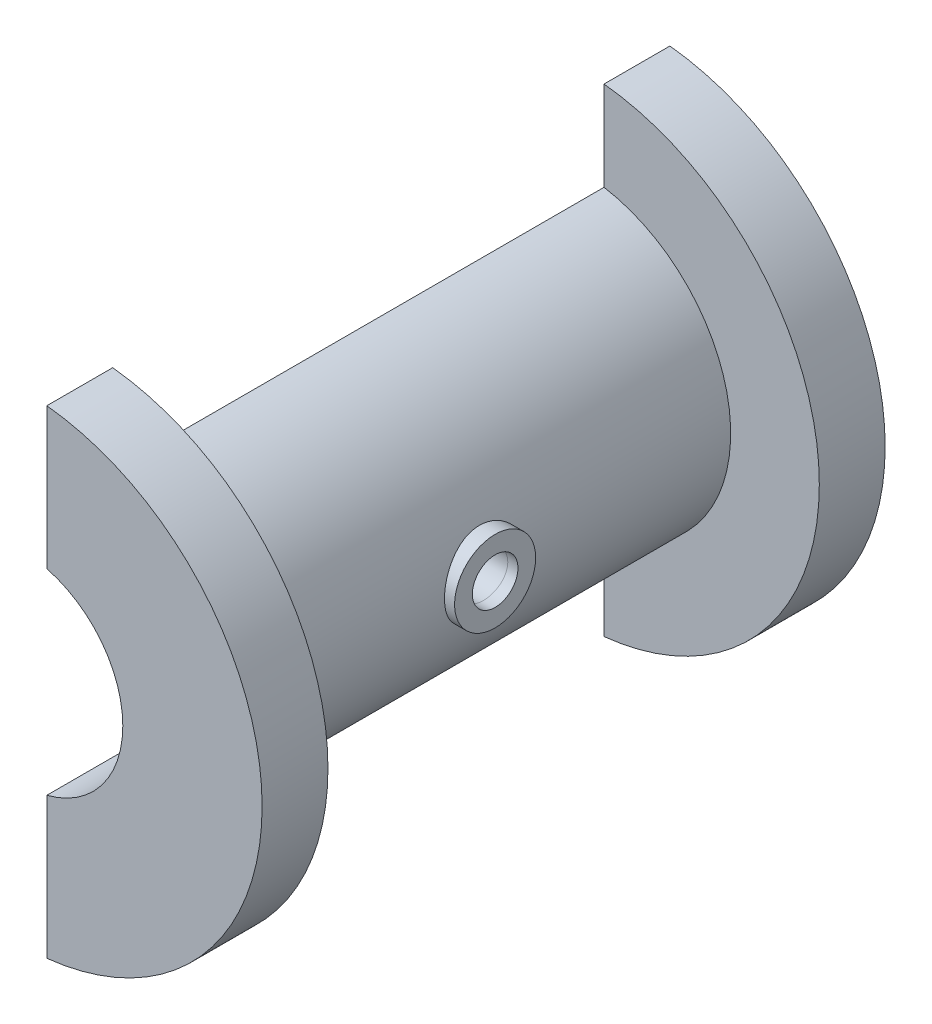
ISO-10303-21;
HEADER;
FILE_DESCRIPTION(('STEP AP214'),'2;1');
FILE_NAME('part.step','',(''),(''),'','','');
FILE_SCHEMA(('AUTOMOTIVE_DESIGN { 1 0 10303 214 1 1 1 1 }'));
ENDSEC;
DATA;
#1=APPLICATION_CONTEXT('core data for automotive mechanical design processes');
#2=APPLICATION_PROTOCOL_DEFINITION('international standard','automotive_design',2000,#1);
#3=PRODUCT_CONTEXT('',#1,'mechanical');
#4=PRODUCT('Part','Part','',(#3));
#5=PRODUCT_RELATED_PRODUCT_CATEGORY('part','',(#4));
#6=PRODUCT_DEFINITION_FORMATION('','',#4);
#7=PRODUCT_DEFINITION_CONTEXT('part definition',#1,'design');
#8=PRODUCT_DEFINITION('design','',#6,#7);
#9=PRODUCT_DEFINITION_SHAPE('','',#8);
#10=(LENGTH_UNIT() NAMED_UNIT(*) SI_UNIT(.MILLI.,.METRE.));
#11=(NAMED_UNIT(*) PLANE_ANGLE_UNIT() SI_UNIT($,.RADIAN.));
#12=(NAMED_UNIT(*) SI_UNIT($,.STERADIAN.) SOLID_ANGLE_UNIT());
#13=UNCERTAINTY_MEASURE_WITH_UNIT(LENGTH_MEASURE(1.E-05),#10,'distance_accuracy_value','');
#14=(GEOMETRIC_REPRESENTATION_CONTEXT(3) GLOBAL_UNCERTAINTY_ASSIGNED_CONTEXT((#13)) GLOBAL_UNIT_ASSIGNED_CONTEXT((#10,
#11,#12)) REPRESENTATION_CONTEXT('',''));
#15=CARTESIAN_POINT('',(0.,0.,0.));
#16=DIRECTION('',(0.,0.,1.));
#17=DIRECTION('',(1.,0.,0.));
#18=AXIS2_PLACEMENT_3D('',#15,#16,#17);
#19=CARTESIAN_POINT('',(0.,0.,55.));
#20=DIRECTION('',(0.,0.,-1.));
#21=DIRECTION('',(-1.,0.,0.));
#22=AXIS2_PLACEMENT_3D('',#19,#20,#21);
#23=CYLINDRICAL_SURFACE('',#22,30.);
#24=CARTESIAN_POINT('',(30.,0.,-4.50000000000001));
#25=CARTESIAN_POINT('',(29.9999959731389,-0.251254633444927,-4.49998963855429));
#26=CARTESIAN_POINT('',(29.9968104761112,-0.502655055246397,-4.47888599747811));
#27=CARTESIAN_POINT('',(29.9844094791956,-0.998428883984741,-4.39505040005176));
#28=CARTESIAN_POINT('',(29.9751881081542,-1.24279520692269,-4.33227791116533));
#29=CARTESIAN_POINT('',(29.9517516365858,-1.71725425866558,-4.16702248509714));
#30=CARTESIAN_POINT('',(29.9375403111276,-1.9473576234804,-4.06456956148216));
#31=CARTESIAN_POINT('',(29.9056942773517,-2.38707128590577,-3.82293486174942));
#32=CARTESIAN_POINT('',(29.8880600445832,-2.59668442417557,-3.68375818674792));
#33=CARTESIAN_POINT('',(29.8511751297436,-2.99114015868638,-3.37146820518038));
#34=CARTESIAN_POINT('',(29.8319140167099,-3.17579949667651,-3.19812463137539));
#35=CARTESIAN_POINT('',(29.7940278339972,-3.51352472006846,-2.8229169333184));
#36=CARTESIAN_POINT('',(29.7754028009551,-3.66658878818808,-2.62105116966444));
#37=CARTESIAN_POINT('',(29.7407963237618,-3.93749188499829,-2.19329806943253));
#38=CARTESIAN_POINT('',(29.7248283592509,-4.05515361111616,-1.967297259056));
#39=CARTESIAN_POINT('',(29.697486339188,-4.25077896513169,-1.49846153806372));
#40=CARTESIAN_POINT('',(29.6861120332635,-4.3287447566749,-1.25562754576833));
#41=CARTESIAN_POINT('',(29.6693476865602,-4.44219596396734,-0.761945874384857));
#42=CARTESIAN_POINT('',(29.6639134722375,-4.47799510921554,-0.511171819775932));
#43=CARTESIAN_POINT('',(29.6595104691175,-4.50706872101798,-0.00712150203816632));
#44=CARTESIAN_POINT('',(29.6605413090944,-4.50034562921389,0.246154616587482));
#45=CARTESIAN_POINT('',(29.6689115505723,-4.44482199752363,0.745803240582428));
#46=CARTESIAN_POINT('',(29.6761985628465,-4.39637087783252,0.99221557945441));
#47=CARTESIAN_POINT('',(29.696178243791,-4.25931352211203,1.47337310661459));
#48=CARTESIAN_POINT('',(29.7088710653814,-4.17070615013437,1.70811796464224));
#49=CARTESIAN_POINT('',(29.7382900663644,-3.9554881058921,2.16034011384858));
#50=CARTESIAN_POINT('',(29.7550319029958,-3.82872942849594,2.37774590727718));
#51=CARTESIAN_POINT('',(29.7906512272364,-3.54091239386865,2.78833378734581));
#52=CARTESIAN_POINT('',(29.809528854975,-3.37985178547435,2.98151428280812));
#53=CARTESIAN_POINT('',(29.8475241916863,-3.02608479234744,3.34019298221916));
#54=CARTESIAN_POINT('',(29.8666424133844,-2.83307798892601,3.50539497085903));
#55=CARTESIAN_POINT('',(29.9027894294539,-2.42192126968256,3.80110780352179));
#56=CARTESIAN_POINT('',(29.9198182146753,-2.20377124376451,3.9316184956317));
#57=CARTESIAN_POINT('',(29.9498854675618,-1.74826379464106,4.15425925949865));
#58=CARTESIAN_POINT('',(29.9629215577628,-1.51089503351034,4.2463664755209));
#59=CARTESIAN_POINT('',(29.9835147167121,-1.02381954746118,4.38932816905614));
#60=CARTESIAN_POINT('',(29.991072155864,-0.774113657857802,4.44018543544674));
#61=CARTESIAN_POINT('',(29.9998074340161,-0.272008702930939,4.49880968945009));
#62=CARTESIAN_POINT('',(30.0010455627116,-0.0196581956114106,4.50698391413798));
#63=CARTESIAN_POINT('',(29.9971668304568,0.48281003298685,4.48109098406694));
#64=CARTESIAN_POINT('',(29.992050166241,0.732927823145633,4.44702513699572));
#65=CARTESIAN_POINT('',(29.97607405846,1.22259716229423,4.33795769946738));
#66=CARTESIAN_POINT('',(29.9652424562395,1.46219388923952,4.26315451190747));
#67=CARTESIAN_POINT('',(29.9390470697511,1.925444875929,4.07494500761474));
#68=CARTESIAN_POINT('',(29.923683072647,2.14909838638531,3.96153687799912));
#69=CARTESIAN_POINT('',(29.8899804740606,2.57590493787577,3.69838132630843));
#70=CARTESIAN_POINT('',(29.8716210488024,2.77889702967471,3.54837557996169));
#71=CARTESIAN_POINT('',(29.8340358903649,3.15697101953313,3.21664256511377));
#72=CARTESIAN_POINT('',(29.814810106886,3.33205129438022,3.03491345302606));
#73=CARTESIAN_POINT('',(29.7774679291348,3.65081354871587,2.64307940047054));
#74=CARTESIAN_POINT('',(29.7593620805276,3.79422254242264,2.4327512244157));
#75=CARTESIAN_POINT('',(29.7264965731471,4.04367387811753,1.9907518784647));
#76=CARTESIAN_POINT('',(29.7117368239688,4.14971722969308,1.75908128543561));
#77=CARTESIAN_POINT('',(29.6873109902593,4.32100401971831,1.28178739913061));
#78=CARTESIAN_POINT('',(29.6776269901931,4.38639111424907,1.03621661708627));
#79=CARTESIAN_POINT('',(29.6644014689341,4.4749664850476,0.537422953694681));
#80=CARTESIAN_POINT('',(29.6608595235531,4.49815767549201,0.284200602015978));
#81=CARTESIAN_POINT('',(29.6603349783252,4.5016136000832,-0.219987189947346));
#82=CARTESIAN_POINT('',(29.6632867900051,4.48230756501939,-0.470949725270765));
#83=CARTESIAN_POINT('',(29.6752746183352,4.40223688633137,-0.966015789970552));
#84=CARTESIAN_POINT('',(29.6843106252335,4.34147230915882,-1.21011933034018));
#85=CARTESIAN_POINT('',(29.7074257833689,4.18036120555996,-1.68441924670298));
#86=CARTESIAN_POINT('',(29.7215011114823,4.08004467972943,-1.91462601130032));
#87=CARTESIAN_POINT('',(29.7531136367311,3.84272002926928,-2.35501090140721));
#88=CARTESIAN_POINT('',(29.7706509510817,3.70571066224506,-2.56518834841094));
#89=CARTESIAN_POINT('',(29.8074223009481,3.39733012977493,-2.96172917392552));
#90=CARTESIAN_POINT('',(29.826671036459,3.22564107119417,-3.14784399974121));
#91=CARTESIAN_POINT('',(29.8645736647991,2.85344652324851,-3.48877366436348));
#92=CARTESIAN_POINT('',(29.8832274183228,2.65293434505283,-3.64358121772849));
#93=CARTESIAN_POINT('',(29.9179555737156,2.22748712263117,-3.9182630298221));
#94=CARTESIAN_POINT('',(29.9340152138646,2.00242373029428,-4.03794032764425));
#95=CARTESIAN_POINT('',(29.9616008640888,1.53525561074616,-4.23761555027415));
#96=CARTESIAN_POINT('',(29.9731315669727,1.29316883129011,-4.31765457016107));
#97=CARTESIAN_POINT('',(29.9877281778452,0.874997183667988,-4.41762402813033));
#98=CARTESIAN_POINT('',(29.9923064753867,0.701493400485836,-4.44846780461644));
#99=CARTESIAN_POINT('',(29.9984437784369,0.352016914800376,-4.48965929313794));
#100=CARTESIAN_POINT('',(30.0000028214632,0.176044243003252,-4.50000725985765));
#101=CARTESIAN_POINT('',(30.,0.,-4.50000000000001));
#102=B_SPLINE_CURVE_WITH_KNOTS('',3,(#24,#25,#26,#27,#28,#29,#30,#31,#32,#33,#34,#35,#36,#37,
#38,#39,#40,#41,#42,#43,#44,#45,#46,#47,#48,#49,#50,#51,#52,#53,#54,#55,#56,#57,#58,#59,#60,#61,
#62,#63,#64,#65,#66,#67,#68,#69,#70,#71,#72,#73,#74,#75,#76,#77,#78,#79,#80,#81,#82,#83,#84,#85,
#86,#87,#88,#89,#90,#91,#92,#93,#94,#95,#96,#97,#98,#99,#100,#101),.UNSPECIFIED.,.T.,.F.,(4,2,2,
2,2,2,2,2,2,2,2,2,2,2,2,2,2,2,2,2,2,2,2,2,2,2,2,2,2,2,2,2,2,2,2,2,2,2,4),(0.,0.753120615094991,
1.50697488878745,2.26026007074972,3.0134406725928,3.77188248410531,4.53036790717741,
5.29259107186126,6.05477268676519,6.81124693817774,7.56767775296949,8.31783531587241,
9.06801410071086,9.82114150428479,10.5743183492561,11.3350287376623,12.0957424571601,
12.8569082695463,13.6180226158021,14.3718617563277,15.1256775597347,15.8758544689785,
16.6260666112882,17.3817356411073,18.1374486008589,18.8994409975402,19.661412804265,
20.4206767037151,21.1798881641153,21.931466647832,22.683043926887,23.4340522195244,
24.1850859440064,24.9433448989717,25.701780104062,26.4643897015421,27.2262069978433,
27.7538955593643,28.2815775636988),.UNSPECIFIED.);
#103=CARTESIAN_POINT('',(30.,0.,-4.50000000000001));
#104=VERTEX_POINT('',#103);
#105=EDGE_CURVE('E56',#104,#104,#102,.T.);
#106=ORIENTED_EDGE('',*,*,#105,.F.);
#107=EDGE_LOOP('',(#106));
#108=FACE_BOUND('',#107,.T.);
#109=CARTESIAN_POINT('',(30.,0.,-8.));
#110=CARTESIAN_POINT('',(30.0000047930632,0.22057865009321,-8.00000755332287));
#111=CARTESIAN_POINT('',(29.9975638847037,0.441078618604162,-7.99087627556735));
#112=CARTESIAN_POINT('',(29.9878789889454,0.880527690255312,-7.95444770219838));
#113=CARTESIAN_POINT('',(29.9806345555866,1.09947664749168,-7.92714871989159));
#114=CARTESIAN_POINT('',(29.9615348022887,1.53421519571787,-7.85460236442112));
#115=CARTESIAN_POINT('',(29.9496784086729,1.75000403887752,-7.80935081180211));
#116=CARTESIAN_POINT('',(29.9216767769691,2.17693220172064,-7.70126399759681));
#117=CARTESIAN_POINT('',(29.9055299556575,2.38806977381498,-7.63842224453932));
#118=CARTESIAN_POINT('',(29.8694188162848,2.80379881164419,-7.4957939795611));
#119=CARTESIAN_POINT('',(29.8494609914201,3.00840073050494,-7.41603626386912));
#120=CARTESIAN_POINT('',(29.8062369400106,3.41014305480076,-7.24009882296535));
#121=CARTESIAN_POINT('',(29.7829694748771,3.60728063167395,-7.14391294701548));
#122=CARTESIAN_POINT('',(29.7337577302115,3.99266560536458,-6.9358887987671));
#123=CARTESIAN_POINT('',(29.7078144626916,4.1809163242878,-6.82405643844286));
#124=CARTESIAN_POINT('',(29.6539125450337,4.54750659590856,-6.58544143947835));
#125=CARTESIAN_POINT('',(29.6259529754043,4.72584156024369,-6.45865196299242));
#126=CARTESIAN_POINT('',(29.5681624094277,5.07501132612923,-6.18821734994425));
#127=CARTESIAN_POINT('',(29.5383045499937,5.2456122549541,-6.04427591580773));
#128=CARTESIAN_POINT('',(29.4780857786048,5.57407686176036,-5.74276474016173));
#129=CARTESIAN_POINT('',(29.4477250871443,5.73194595333085,-5.58520085061507));
#130=CARTESIAN_POINT('',(29.3873016651863,6.03409106421435,-5.25732528100958));
#131=CARTESIAN_POINT('',(29.3572391022953,6.17835978656728,-5.08700684473829));
#132=CARTESIAN_POINT('',(29.2982717118578,6.45220041997692,-4.73485391967478));
#133=CARTESIAN_POINT('',(29.2693664560245,6.58177780102008,-4.55302375656895));
#134=CARTESIAN_POINT('',(29.2130229538656,6.82755230890043,-4.17565777886857));
#135=CARTESIAN_POINT('',(29.1856194941863,6.94347370726023,-3.97993702857694));
#136=CARTESIAN_POINT('',(29.1336671025411,7.15832798081868,-3.57910981329244));
#137=CARTESIAN_POINT('',(29.1091171376739,7.25726700947707,-3.37400678217522));
#138=CARTESIAN_POINT('',(29.0636080698031,7.43742733698699,-2.95576083314441));
#139=CARTESIAN_POINT('',(29.0426491291002,7.51864783507398,-2.74261755237322));
#140=CARTESIAN_POINT('',(29.0049801777024,7.6626805607475,-2.30983414343199));
#141=CARTESIAN_POINT('',(28.9882700500103,7.72549329522525,-2.09019419434291));
#142=CARTESIAN_POINT('',(28.959956929466,7.83095203764005,-1.65106697573491));
#143=CARTESIAN_POINT('',(28.9482471463236,7.87402134875791,-1.43168822324177));
#144=CARTESIAN_POINT('',(28.9297630127215,7.94166516963208,-0.989893894342027));
#145=CARTESIAN_POINT('',(28.9229885283003,7.96624018138969,-0.767478400530273));
#146=CARTESIAN_POINT('',(28.9145897070143,7.99667132852926,-0.321308138483168));
#147=CARTESIAN_POINT('',(28.9129645665069,8.00253038485544,-0.0975535846925474));
#148=CARTESIAN_POINT('',(28.9149140483281,7.99548370789002,0.349635096079179));
#149=CARTESIAN_POINT('',(28.9184885864692,7.98257827841272,0.573069228189577));
#150=CARTESIAN_POINT('',(28.9305510183289,7.93874759581896,1.01167731618271));
#151=CARTESIAN_POINT('',(28.9388980708057,7.90833871941777,1.22690699627628));
#152=CARTESIAN_POINT('',(28.9601504503289,7.8301548664798,1.65403376182829));
#153=CARTESIAN_POINT('',(28.9730573101537,7.78237405021191,1.86592970160161));
#154=CARTESIAN_POINT('',(29.0030456839358,7.66985820348008,2.28479534122952));
#155=CARTESIAN_POINT('',(29.0201259302455,7.60512832079333,2.49176651605031));
#156=CARTESIAN_POINT('',(29.0579792646434,7.45919034864218,2.89955085854656));
#157=CARTESIAN_POINT('',(29.0787537400112,7.37797606722872,3.1003616795159));
#158=CARTESIAN_POINT('',(29.1236513457429,7.19871913874445,3.49660447511281));
#159=CARTESIAN_POINT('',(29.1478085210257,7.10050264502397,3.6919539188678));
#160=CARTESIAN_POINT('',(29.1986278932288,6.88854155962722,4.07378122001695));
#161=CARTESIAN_POINT('',(29.2252909505939,6.77479162811626,4.26025599676473));
#162=CARTESIAN_POINT('',(29.2803849259846,6.5325706304109,4.62310540084657));
#163=CARTESIAN_POINT('',(29.3088158329833,6.40409965603451,4.79948009116656));
#164=CARTESIAN_POINT('',(29.366683469807,6.13327573010405,5.14105402059826));
#165=CARTESIAN_POINT('',(29.3961202218952,5.99092247115372,5.30625301210856));
#166=CARTESIAN_POINT('',(29.4561934526224,5.68834118264564,5.6296900884806));
#167=CARTESIAN_POINT('',(29.4868375912612,5.52767975596179,5.78752159797573));
#168=CARTESIAN_POINT('',(29.5475063444805,5.19361849033296,6.08908414266926));
#169=CARTESIAN_POINT('',(29.577531159608,5.02022286058342,6.2328198007854));
#170=CARTESIAN_POINT('',(29.6361528289599,4.66169990972495,6.50532651167013));
#171=CARTESIAN_POINT('',(29.6647490841118,4.47656773947657,6.63409131589889));
#172=CARTESIAN_POINT('',(29.7196959795788,4.09592807500753,6.87562058032551));
#173=CARTESIAN_POINT('',(29.7460474903499,3.90042465066466,6.98839125403335));
#174=CARTESIAN_POINT('',(29.7959007840006,3.49933186872605,7.19764429468463));
#175=CARTESIAN_POINT('',(29.8193883919427,3.29369889679403,7.29404650042563));
#176=CARTESIAN_POINT('',(29.8626905301685,2.87472517640484,7.46910168895653));
#177=CARTESIAN_POINT('',(29.8825064328149,2.66138734354211,7.54776130574181));
#178=CARTESIAN_POINT('',(29.9179062239643,2.22846399646919,7.68671780824326));
#179=CARTESIAN_POINT('',(29.9334900581488,2.00887840210926,7.74701445827288));
#180=CARTESIAN_POINT('',(29.9599711289042,1.56509795980903,7.84871229506155));
#181=CARTESIAN_POINT('',(29.9708684981238,1.34090324251667,7.89011401663734));
#182=CARTESIAN_POINT('',(29.9874143846419,0.896138562380166,7.952729388177));
#183=CARTESIAN_POINT('',(29.9932054526486,0.67565101396004,7.97449174202197));
#184=CARTESIAN_POINT('',(29.9999053106141,0.233557953828446,7.99965421489813));
#185=CARTESIAN_POINT('',(30.0008141902206,0.0119524627196583,8.00305467109423));
#186=CARTESIAN_POINT('',(29.9977244037236,-0.430720407408283,7.99146418408705));
#187=CARTESIAN_POINT('',(29.9937262042334,-0.651787835589003,7.97647498955284));
#188=CARTESIAN_POINT('',(29.9809348682821,-1.09178012606607,7.92824037297712));
#189=CARTESIAN_POINT('',(29.9721417548676,-1.31070499865534,7.89499503868279));
#190=CARTESIAN_POINT('',(29.9501982854821,-1.74104501006533,7.81127239096026));
#191=CARTESIAN_POINT('',(29.9371263701292,-1.95252453742277,7.76110483103405));
#192=CARTESIAN_POINT('',(29.9069327349073,-2.37050563135301,7.64381029906287));
#193=CARTESIAN_POINT('',(29.8898096482769,-2.57700549194881,7.57667760289402));
#194=CARTESIAN_POINT('',(29.851972531426,-2.98352164314614,7.42600675636972));
#195=CARTESIAN_POINT('',(29.8312594934855,-3.18353970726197,7.34247313846386));
#196=CARTESIAN_POINT('',(29.7867703566693,-3.57593636687409,7.1595778616985));
#197=CARTESIAN_POINT('',(29.7629931085837,-3.76831206056049,7.0602102610954));
#198=CARTESIAN_POINT('',(29.7125131434758,-4.14775826908602,6.84431590139304));
#199=CARTESIAN_POINT('',(29.6857629669212,-4.33465565508777,6.72749594747023));
#200=CARTESIAN_POINT('',(29.6304241052245,-4.69805995168527,6.47894372317594));
#201=CARTESIAN_POINT('',(29.6018347849963,-4.87456323229017,6.34720628948886));
#202=CARTESIAN_POINT('',(29.5435821401274,-5.21600943606102,6.06973146605595));
#203=CARTESIAN_POINT('',(29.5139188100511,-5.38095230070637,5.92399400544869));
#204=CARTESIAN_POINT('',(29.4543038977114,-5.69824941655326,5.61945822117415));
#205=CARTESIAN_POINT('',(29.4243523115153,-5.85060349573143,5.46065971908936));
#206=CARTESIAN_POINT('',(29.3641150587543,-6.14590109448046,5.12630946683875));
#207=CARTESIAN_POINT('',(29.3338440974522,-6.28845400395986,4.95040980495906));
#208=CARTESIAN_POINT('',(29.2747180395519,-6.55819708628246,4.58707182130096));
#209=CARTESIAN_POINT('',(29.2458624615622,-6.68539250423754,4.39963747222171));
#210=CARTESIAN_POINT('',(29.1903856403262,-6.9236084832326,4.01434447027581));
#211=CARTESIAN_POINT('',(29.163765200616,-7.03462323776119,3.81648210977698));
#212=CARTESIAN_POINT('',(29.1135738024769,-7.23954079101904,3.41181238404079));
#213=CARTESIAN_POINT('',(29.090001613314,-7.33345050222161,3.2050086741668));
#214=CARTESIAN_POINT('',(29.0467327109949,-7.50299524013639,2.78497290269581));
#215=CARTESIAN_POINT('',(29.0270155048398,-7.57872741686942,2.57178219060545));
#216=CARTESIAN_POINT('',(28.9919142970287,-7.71191627952162,2.13950376540742));
#217=CARTESIAN_POINT('',(28.9765286332904,-7.7693799764461,1.92041834964292));
#218=CARTESIAN_POINT('',(28.9505679624228,-7.86556421887175,1.47789299709294));
#219=CARTESIAN_POINT('',(28.9399928457768,-7.90428519106988,1.25445315956074));
#220=CARTESIAN_POINT('',(28.9239941302563,-7.96263042731845,0.804912946589066));
#221=CARTESIAN_POINT('',(28.9185703860099,-7.9822552302634,0.578812646410192));
#222=CARTESIAN_POINT('',(28.9131408569839,-8.00189864511034,0.133142456262339));
#223=CARTESIAN_POINT('',(28.9129630489633,-8.00253976703757,-0.0863981384429999));
#224=CARTESIAN_POINT('',(28.9175953549484,-7.98578455758701,-0.524736290840258));
#225=CARTESIAN_POINT('',(28.9224054196029,-7.96838840467467,-0.743533855862414));
#226=CARTESIAN_POINT('',(28.9368664188399,-7.91571252441199,-1.17879225448724));
#227=CARTESIAN_POINT('',(28.9465171659621,-7.88043348959388,-1.39525317824714));
#228=CARTESIAN_POINT('',(28.9703679303139,-7.7922950777922,-1.82430878777427));
#229=CARTESIAN_POINT('',(28.984567970625,-7.73943561161185,-2.03690345391974));
#230=CARTESIAN_POINT('',(29.0169661243449,-7.61706278409508,-2.45508496971404));
#231=CARTESIAN_POINT('',(29.0351316225571,-7.54768488472808,-2.66071403742376));
#232=CARTESIAN_POINT('',(29.0750112653577,-7.39257259459484,-3.0654283339916));
#233=CARTESIAN_POINT('',(29.0967266070745,-7.30683268436169,-3.2645113279915));
#234=CARTESIAN_POINT('',(29.1430927062825,-7.11965152069296,-3.65477718182274));
#235=CARTESIAN_POINT('',(29.1677432688522,-7.01821130974537,-3.84596056511511));
#236=CARTESIAN_POINT('',(29.2193091692493,-6.80033085633953,-4.2192667971175));
#237=CARTESIAN_POINT('',(29.2462246241178,-6.68388983853063,-4.40138917681408));
#238=CARTESIAN_POINT('',(29.3024167838015,-6.43314499527037,-4.76067595224268));
#239=CARTESIAN_POINT('',(29.3317396628692,-6.29841639334604,-4.93753679841954));
#240=CARTESIAN_POINT('',(29.3912111016278,-6.01479007415766,-5.27935835072935));
#241=CARTESIAN_POINT('',(29.4213596746671,-5.86589212773197,-5.44431886432163));
#242=CARTESIAN_POINT('',(29.4816665381721,-5.55485666421669,-5.76132690170297));
#243=CARTESIAN_POINT('',(29.5118248292071,-5.39271590772654,-5.91337124732529));
#244=CARTESIAN_POINT('',(29.5713266043132,-5.05626570232196,-6.20350885082049));
#245=CARTESIAN_POINT('',(29.6006701046229,-4.88195649616389,-6.34160238687275));
#246=CARTESIAN_POINT('',(29.6583696669233,-4.51837437064452,-6.60574493005633));
#247=CARTESIAN_POINT('',(29.6866906027378,-4.32885920866295,-6.73146849206309));
#248=CARTESIAN_POINT('',(29.7408465182512,-3.93962503807925,-6.9664206980443));
#249=CARTESIAN_POINT('',(29.7666824058184,-3.73990979703194,-7.07565537430734));
#250=CARTESIAN_POINT('',(29.8151368355485,-3.3316399704608,-7.27680726839905));
#251=CARTESIAN_POINT('',(29.8377565403202,-3.12308861464552,-7.36873074792176));
#252=CARTESIAN_POINT('',(29.8791381252941,-2.6986372013561,-7.53454099060095));
#253=CARTESIAN_POINT('',(29.8979005233857,-2.48273813494224,-7.60843017532587));
#254=CARTESIAN_POINT('',(29.9421638772526,-1.89769086313885,-7.78102274388028));
#255=CARTESIAN_POINT('',(29.9637077907291,-1.5231488606223,-7.86298348522678));
#256=CARTESIAN_POINT('',(29.9926209941337,-0.765658396861658,-7.9724628724238));
#257=CARTESIAN_POINT('',(29.9999916838873,-0.382710769582184,-7.99998689475156));
#258=CARTESIAN_POINT('',(30.,0.,-8.));
#259=B_SPLINE_CURVE_WITH_KNOTS('',3,(#109,#110,#111,#112,#113,#114,#115,#116,#117,#118,#119,
#120,#121,#122,#123,#124,#125,#126,#127,#128,#129,#130,#131,#132,#133,#134,#135,#136,#137,#138,
#139,#140,#141,#142,#143,#144,#145,#146,#147,#148,#149,#150,#151,#152,#153,#154,#155,#156,#157,
#158,#159,#160,#161,#162,#163,#164,#165,#166,#167,#168,#169,#170,#171,#172,#173,#174,#175,#176,
#177,#178,#179,#180,#181,#182,#183,#184,#185,#186,#187,#188,#189,#190,#191,#192,#193,#194,#195,
#196,#197,#198,#199,#200,#201,#202,#203,#204,#205,#206,#207,#208,#209,#210,#211,#212,#213,#214,
#215,#216,#217,#218,#219,#220,#221,#222,#223,#224,#225,#226,#227,#228,#229,#230,#231,#232,#233,
#234,#235,#236,#237,#238,#239,#240,#241,#242,#243,#244,#245,#246,#247,#248,#249,#250,#251,#252,
#253,#254,#255,#256,#257,#258),.UNSPECIFIED.,.T.,.F.,(4,2,2,2,2,2,2,2,2,2,2,2,2,2,2,2,2,2,2,2,2,
2,2,2,2,2,2,2,2,2,2,2,2,2,2,2,2,2,2,2,2,2,2,2,2,2,2,2,2,2,2,2,2,2,2,2,2,2,2,2,2,2,2,2,2,2,2,2,2,
2,2,2,2,2,4),(0.,0.66139823304869,1.32285787901007,1.98447160679912,2.64632981853879,
3.3070702574184,3.96805862339447,4.62879790814604,5.28984043791279,5.96466429305822,
6.63919968283205,7.31409494326413,7.98873809084503,8.67525864701595,9.36152991903384,
10.0478321997124,10.7341155800347,11.4049041084223,12.0756744285578,12.7463400584224,
13.4169948297135,14.0688103050949,14.7208450969063,15.3726820816984,16.0247643672578,
16.6839572310016,17.3433772745751,18.0027932054408,18.6622237411095,19.3433032278852,
20.0241585935002,20.7052971222626,21.3861703085458,22.0702873433142,22.7541481595407,
23.4380177526714,24.1218679878248,24.7859608021704,25.4500414222672,26.114058899934,
26.7780731860633,27.4305389784524,28.0832252107559,28.7357313242726,29.3884828715509,
30.0537853451988,30.7193188047653,31.3848556331206,32.0504015544073,32.7348662000305,
33.4190964121669,34.1035715623455,34.7877694864007,35.4682249525505,36.1484189600495,
36.8285974815202,37.5087568077749,38.1665868538479,38.824410391243,39.4822084557194,
40.1400098576775,40.7925921674686,41.4453950060204,42.0981545175428,42.7509477819646,
43.422948394753,44.0949598776946,44.7671362404436,45.4392991973377,46.1260127490717,
46.8124744616758,47.4986873928573,48.1848081315288,49.3324678454551,50.4800142043769),.UNSPECIFIED.);
#260=CARTESIAN_POINT('',(30.,0.,-8.));
#261=VERTEX_POINT('',#260);
#262=EDGE_CURVE('E65',#261,#261,#259,.T.);
#263=ORIENTED_EDGE('',*,*,#262,.F.);
#264=EDGE_LOOP('',(#263));
#265=FACE_BOUND('',#264,.T.);
#266=ADVANCED_FACE('F51',(#108,#265),#23,.F.);
#267=CARTESIAN_POINT('',(4.99800000000001,0.,0.));
#268=DIRECTION('',(1.,0.,0.));
#269=DIRECTION('',(0.,0.,-1.));
#270=AXIS2_PLACEMENT_3D('',#267,#268,#269);
#271=CYLINDRICAL_SURFACE('',#270,8.);
#272=CARTESIAN_POINT('',(32.,0.,0.));
#273=DIRECTION('',(1.,0.,0.));
#274=DIRECTION('',(0.,0.,-1.));
#275=AXIS2_PLACEMENT_3D('',#272,#273,#274);
#276=CIRCLE('',#275,8.);
#277=CARTESIAN_POINT('',(32.,0.,-8.));
#278=VERTEX_POINT('',#277);
#279=EDGE_CURVE('E11',#278,#278,#276,.T.);
#280=ORIENTED_EDGE('',*,*,#279,.F.);
#281=EDGE_LOOP('',(#280));
#282=FACE_BOUND('',#281,.T.);
#283=ORIENTED_EDGE('',*,*,#262,.T.);
#284=EDGE_LOOP('',(#283));
#285=FACE_BOUND('',#284,.T.);
#286=ADVANCED_FACE('F53',(#282,#285),#271,.T.);
#287=CARTESIAN_POINT('',(32.,0.,0.));
#288=DIRECTION('',(1.,0.,0.));
#289=DIRECTION('',(0.,0.,-1.));
#290=AXIS2_PLACEMENT_3D('',#287,#288,#289);
#291=PLANE('',#290);
#292=CARTESIAN_POINT('',(32.,0.,0.));
#293=DIRECTION('',(1.,0.,0.));
#294=DIRECTION('',(0.,0.,-1.));
#295=AXIS2_PLACEMENT_3D('',#292,#293,#294);
#296=CIRCLE('',#295,4.50000000000001);
#297=CARTESIAN_POINT('',(32.,0.,-4.50000000000001));
#298=VERTEX_POINT('',#297);
#299=EDGE_CURVE('E74',#298,#298,#296,.T.);
#300=ORIENTED_EDGE('',*,*,#299,.F.);
#301=EDGE_LOOP('',(#300));
#302=FACE_BOUND('',#301,.T.);
#303=ORIENTED_EDGE('',*,*,#279,.T.);
#304=EDGE_LOOP('',(#303));
#305=FACE_BOUND('',#304,.T.);
#306=ADVANCED_FACE('F78',(#302,#305),#291,.T.);
#307=CARTESIAN_POINT('',(32.,0.,0.));
#308=DIRECTION('',(1.,0.,0.));
#309=DIRECTION('',(0.,0.,-1.));
#310=AXIS2_PLACEMENT_3D('',#307,#308,#309);
#311=CYLINDRICAL_SURFACE('',#310,4.50000000000001);
#312=ORIENTED_EDGE('',*,*,#105,.T.);
#313=EDGE_LOOP('',(#312));
#314=FACE_BOUND('',#313,.T.);
#315=ORIENTED_EDGE('',*,*,#299,.T.);
#316=EDGE_LOOP('',(#315));
#317=FACE_BOUND('',#316,.T.);
#318=ADVANCED_FACE('F79',(#314,#317),#311,.F.);
#319=CLOSED_SHELL('',(#266,#286,#306,#318));
#320=MANIFOLD_SOLID_BREP('B2',#319);
#321=CARTESIAN_POINT('',(0.,0.,55.));
#322=DIRECTION('',(0.,0.,-1.));
#323=DIRECTION('',(-1.,0.,0.));
#324=AXIS2_PLACEMENT_3D('',#321,#322,#323);
#325=CYLINDRICAL_SURFACE('',#324,30.);
#326=CARTESIAN_POINT('',(30.,0.,-4.50000000000001));
#327=CARTESIAN_POINT('',(29.9999959731389,-0.251254633444927,-4.49998963855429));
#328=CARTESIAN_POINT('',(29.9968104761112,-0.502655055246397,-4.47888599747811));
#329=CARTESIAN_POINT('',(29.9844094791956,-0.998428883984741,-4.39505040005176));
#330=CARTESIAN_POINT('',(29.9751881081542,-1.24279520692269,-4.33227791116533));
#331=CARTESIAN_POINT('',(29.9517516365858,-1.71725425866558,-4.16702248509714));
#332=CARTESIAN_POINT('',(29.9375403111276,-1.9473576234804,-4.06456956148216));
#333=CARTESIAN_POINT('',(29.9056942773517,-2.38707128590577,-3.82293486174942));
#334=CARTESIAN_POINT('',(29.8880600445832,-2.59668442417557,-3.68375818674792));
#335=CARTESIAN_POINT('',(29.8511751297436,-2.99114015868638,-3.37146820518038));
#336=CARTESIAN_POINT('',(29.8319140167099,-3.17579949667651,-3.19812463137539));
#337=CARTESIAN_POINT('',(29.7940278339972,-3.51352472006846,-2.8229169333184));
#338=CARTESIAN_POINT('',(29.7754028009551,-3.66658878818808,-2.62105116966444));
#339=CARTESIAN_POINT('',(29.7407963237618,-3.93749188499829,-2.19329806943253));
#340=CARTESIAN_POINT('',(29.7248283592509,-4.05515361111616,-1.967297259056));
#341=CARTESIAN_POINT('',(29.697486339188,-4.25077896513169,-1.49846153806372));
#342=CARTESIAN_POINT('',(29.6861120332635,-4.3287447566749,-1.25562754576833));
#343=CARTESIAN_POINT('',(29.6693476865602,-4.44219596396734,-0.761945874384857));
#344=CARTESIAN_POINT('',(29.6639134722375,-4.47799510921554,-0.511171819775932));
#345=CARTESIAN_POINT('',(29.6595104691175,-4.50706872101798,-0.00712150203816632));
#346=CARTESIAN_POINT('',(29.6605413090944,-4.50034562921389,0.246154616587482));
#347=CARTESIAN_POINT('',(29.6689115505723,-4.44482199752363,0.745803240582428));
#348=CARTESIAN_POINT('',(29.6761985628465,-4.39637087783252,0.99221557945441));
#349=CARTESIAN_POINT('',(29.696178243791,-4.25931352211203,1.47337310661459));
#350=CARTESIAN_POINT('',(29.7088710653814,-4.17070615013437,1.70811796464224));
#351=CARTESIAN_POINT('',(29.7382900663644,-3.9554881058921,2.16034011384858));
#352=CARTESIAN_POINT('',(29.7550319029958,-3.82872942849594,2.37774590727718));
#353=CARTESIAN_POINT('',(29.7906512272364,-3.54091239386865,2.78833378734581));
#354=CARTESIAN_POINT('',(29.809528854975,-3.37985178547435,2.98151428280812));
#355=CARTESIAN_POINT('',(29.8475241916863,-3.02608479234744,3.34019298221916));
#356=CARTESIAN_POINT('',(29.8666424133844,-2.83307798892601,3.50539497085903));
#357=CARTESIAN_POINT('',(29.9027894294539,-2.42192126968256,3.80110780352179));
#358=CARTESIAN_POINT('',(29.9198182146753,-2.20377124376451,3.9316184956317));
#359=CARTESIAN_POINT('',(29.9498854675618,-1.74826379464106,4.15425925949865));
#360=CARTESIAN_POINT('',(29.9629215577628,-1.51089503351034,4.2463664755209));
#361=CARTESIAN_POINT('',(29.9835147167121,-1.02381954746118,4.38932816905614));
#362=CARTESIAN_POINT('',(29.991072155864,-0.774113657857802,4.44018543544674));
#363=CARTESIAN_POINT('',(29.9998074340161,-0.272008702930939,4.49880968945009));
#364=CARTESIAN_POINT('',(30.0010455627116,-0.0196581956114106,4.50698391413798));
#365=CARTESIAN_POINT('',(29.9971668304568,0.48281003298685,4.48109098406694));
#366=CARTESIAN_POINT('',(29.992050166241,0.732927823145633,4.44702513699572));
#367=CARTESIAN_POINT('',(29.97607405846,1.22259716229423,4.33795769946738));
#368=CARTESIAN_POINT('',(29.9652424562395,1.46219388923952,4.26315451190747));
#369=CARTESIAN_POINT('',(29.9390470697511,1.925444875929,4.07494500761474));
#370=CARTESIAN_POINT('',(29.923683072647,2.14909838638531,3.96153687799912));
#371=CARTESIAN_POINT('',(29.8899804740606,2.57590493787577,3.69838132630843));
#372=CARTESIAN_POINT('',(29.8716210488024,2.77889702967471,3.54837557996169));
#373=CARTESIAN_POINT('',(29.8340358903649,3.15697101953313,3.21664256511377));
#374=CARTESIAN_POINT('',(29.814810106886,3.33205129438022,3.03491345302606));
#375=CARTESIAN_POINT('',(29.7774679291348,3.65081354871587,2.64307940047054));
#376=CARTESIAN_POINT('',(29.7593620805276,3.79422254242264,2.4327512244157));
#377=CARTESIAN_POINT('',(29.7264965731471,4.04367387811753,1.9907518784647));
#378=CARTESIAN_POINT('',(29.7117368239688,4.14971722969308,1.75908128543561));
#379=CARTESIAN_POINT('',(29.6873109902593,4.32100401971831,1.28178739913061));
#380=CARTESIAN_POINT('',(29.6776269901931,4.38639111424907,1.03621661708627));
#381=CARTESIAN_POINT('',(29.6644014689341,4.4749664850476,0.537422953694681));
#382=CARTESIAN_POINT('',(29.6608595235531,4.49815767549201,0.284200602015978));
#383=CARTESIAN_POINT('',(29.6603349783252,4.5016136000832,-0.219987189947346));
#384=CARTESIAN_POINT('',(29.6632867900051,4.48230756501939,-0.470949725270765));
#385=CARTESIAN_POINT('',(29.6752746183352,4.40223688633137,-0.966015789970552));
#386=CARTESIAN_POINT('',(29.6843106252335,4.34147230915882,-1.21011933034018));
#387=CARTESIAN_POINT('',(29.7074257833689,4.18036120555996,-1.68441924670298));
#388=CARTESIAN_POINT('',(29.7215011114823,4.08004467972943,-1.91462601130032));
#389=CARTESIAN_POINT('',(29.7531136367311,3.84272002926928,-2.35501090140721));
#390=CARTESIAN_POINT('',(29.7706509510817,3.70571066224506,-2.56518834841094));
#391=CARTESIAN_POINT('',(29.8074223009481,3.39733012977493,-2.96172917392552));
#392=CARTESIAN_POINT('',(29.826671036459,3.22564107119417,-3.14784399974121));
#393=CARTESIAN_POINT('',(29.8645736647991,2.85344652324851,-3.48877366436348));
#394=CARTESIAN_POINT('',(29.8832274183228,2.65293434505283,-3.64358121772849));
#395=CARTESIAN_POINT('',(29.9179555737156,2.22748712263117,-3.9182630298221));
#396=CARTESIAN_POINT('',(29.9340152138646,2.00242373029428,-4.03794032764425));
#397=CARTESIAN_POINT('',(29.9616008640888,1.53525561074616,-4.23761555027415));
#398=CARTESIAN_POINT('',(29.9731315669727,1.29316883129011,-4.31765457016107));
#399=CARTESIAN_POINT('',(29.9877281778452,0.874997183667988,-4.41762402813033));
#400=CARTESIAN_POINT('',(29.9923064753867,0.701493400485836,-4.44846780461644));
#401=CARTESIAN_POINT('',(29.9984437784369,0.352016914800376,-4.48965929313794));
#402=CARTESIAN_POINT('',(30.0000028214632,0.176044243003252,-4.50000725985765));
#403=CARTESIAN_POINT('',(30.,0.,-4.50000000000001));
#404=B_SPLINE_CURVE_WITH_KNOTS('',3,(#326,#327,#328,#329,#330,#331,#332,#333,#334,#335,#336,
#337,#338,#339,#340,#341,#342,#343,#344,#345,#346,#347,#348,#349,#350,#351,#352,#353,#354,#355,
#356,#357,#358,#359,#360,#361,#362,#363,#364,#365,#366,#367,#368,#369,#370,#371,#372,#373,#374,
#375,#376,#377,#378,#379,#380,#381,#382,#383,#384,#385,#386,#387,#388,#389,#390,#391,#392,#393,
#394,#395,#396,#397,#398,#399,#400,#401,#402,#403),.UNSPECIFIED.,.T.,.F.,(4,2,2,2,2,2,2,2,2,2,2,
2,2,2,2,2,2,2,2,2,2,2,2,2,2,2,2,2,2,2,2,2,2,2,2,2,2,2,4),(0.,0.753120615094991,1.50697488878745,
2.26026007074972,3.0134406725928,3.77188248410531,4.53036790717741,5.29259107186126,
6.05477268676519,6.81124693817774,7.56767775296949,8.31783531587241,9.06801410071086,
9.82114150428479,10.5743183492561,11.3350287376623,12.0957424571601,12.8569082695463,
13.6180226158021,14.3718617563277,15.1256775597347,15.8758544689785,16.6260666112882,
17.3817356411073,18.1374486008589,18.8994409975402,19.661412804265,20.4206767037151,
21.1798881641153,21.931466647832,22.683043926887,23.4340522195244,24.1850859440064,
24.9433448989717,25.701780104062,26.4643897015421,27.2262069978433,27.7538955593643,
28.2815775636988),.UNSPECIFIED.);
#405=CARTESIAN_POINT('',(30.,0.,-4.50000000000001));
#406=VERTEX_POINT('',#405);
#407=EDGE_CURVE('E128',#406,#406,#404,.T.);
#408=ORIENTED_EDGE('',*,*,#407,.T.);
#409=EDGE_LOOP('',(#408));
#410=FACE_BOUND('',#409,.T.);
#411=CARTESIAN_POINT('',(0.,0.,-48.5));
#412=DIRECTION('',(0.,0.,1.));
#413=DIRECTION('',(1.,0.,0.));
#414=AXIS2_PLACEMENT_3D('',#411,#412,#413);
#415=CIRCLE('',#414,30.);
#416=CARTESIAN_POINT('',(4.99999999999998,-29.5803989154981,-48.5));
#417=VERTEX_POINT('',#416);
#418=CARTESIAN_POINT('',(5.,29.5803989154981,-48.5));
#419=VERTEX_POINT('',#418);
#420=EDGE_CURVE('E217',#417,#419,#415,.T.);
#421=ORIENTED_EDGE('',*,*,#420,.T.);
#422=DIRECTION('',(0.,0.,-1.));
#423=VECTOR('',#422,1.);
#424=CARTESIAN_POINT('',(5.,29.5803989154981,55.));
#425=LINE('',#424,#423);
#426=CARTESIAN_POINT('',(5.,29.5803989154981,48.5));
#427=VERTEX_POINT('',#426);
#428=EDGE_CURVE('E150',#427,#419,#425,.T.);
#429=ORIENTED_EDGE('',*,*,#428,.F.);
#430=CARTESIAN_POINT('',(0.,0.,48.5));
#431=DIRECTION('',(0.,0.,1.));
#432=DIRECTION('',(1.,0.,0.));
#433=AXIS2_PLACEMENT_3D('',#430,#431,#432);
#434=CIRCLE('',#433,30.);
#435=CARTESIAN_POINT('',(4.99999999999998,-29.5803989154981,48.5));
#436=VERTEX_POINT('',#435);
#437=EDGE_CURVE('E145',#436,#427,#434,.T.);
#438=ORIENTED_EDGE('',*,*,#437,.F.);
#439=DIRECTION('',(0.,0.,-1.));
#440=VECTOR('',#439,1.);
#441=CARTESIAN_POINT('',(4.99999999999998,-29.5803989154981,55.));
#442=LINE('',#441,#440);
#443=EDGE_CURVE('E138',#436,#417,#442,.T.);
#444=ORIENTED_EDGE('',*,*,#443,.T.);
#445=EDGE_LOOP('',(#421,#429,#438,#444));
#446=FACE_BOUND('',#445,.T.);
#447=ADVANCED_FACE('F123',(#410,#446),#325,.T.);
#448=CARTESIAN_POINT('',(0.,0.,55.));
#449=DIRECTION('',(0.,0.,-1.));
#450=DIRECTION('',(-1.,0.,0.));
#451=AXIS2_PLACEMENT_3D('',#448,#449,#450);
#452=CYLINDRICAL_SURFACE('',#451,20.);
#453=CARTESIAN_POINT('',(20.,0.,-4.50000000000001));
#454=CARTESIAN_POINT('',(19.9999954338904,0.249399960346608,-4.49999174156217));
#455=CARTESIAN_POINT('',(19.9952877428236,0.498898180422602,-4.47919659075362));
#456=CARTESIAN_POINT('',(19.9769627932932,0.990795499492872,-4.39665902083479));
#457=CARTESIAN_POINT('',(19.9633394199304,1.2331896067714,-4.33488849800829));
#458=CARTESIAN_POINT('',(19.9286983938889,1.70369974530906,-4.17244251814813));
#459=CARTESIAN_POINT('',(19.9076886908587,1.93183081768646,-4.07180887671083));
#460=CARTESIAN_POINT('',(19.8605367800248,2.36796486321529,-3.83462882316576));
#461=CARTESIAN_POINT('',(19.8343946452468,2.57596812268903,-3.69808292202009));
#462=CARTESIAN_POINT('',(19.7793422009352,2.96946816791767,-3.39051005358264));
#463=CARTESIAN_POINT('',(19.7503959122016,3.15457563299902,-3.21899140019145));
#464=CARTESIAN_POINT('',(19.6932482680933,3.49365223732972,-2.84739683216353));
#465=CARTESIAN_POINT('',(19.6650469824832,3.64761846933676,-2.64731825423831));
#466=CARTESIAN_POINT('',(19.6122262427517,3.92178125989875,-2.22137727604906));
#467=CARTESIAN_POINT('',(19.5876528158498,4.04155935243901,-1.99523930503057));
#468=CARTESIAN_POINT('',(19.5453881971611,4.24126028571698,-1.52539967777276));
#469=CARTESIAN_POINT('',(19.5276961308561,4.32118819118324,-1.28170025800041));
#470=CARTESIAN_POINT('',(19.5015645153523,4.43762526798723,-0.787890155451554));
#471=CARTESIAN_POINT('',(19.492977805199,4.47482584715177,-0.537950458778091));
#472=CARTESIAN_POINT('',(19.4855874450991,4.50690288527053,-0.0352414650220023));
#473=CARTESIAN_POINT('',(19.4867825199463,4.50178486110461,0.217527458936948));
#474=CARTESIAN_POINT('',(19.4986876447373,4.44992546642538,0.71355001678905));
#475=CARTESIAN_POINT('',(19.5092131966078,4.40399114333707,0.956893130951897));
#476=CARTESIAN_POINT('',(19.5383011739147,4.27308334049235,1.43232816549708));
#477=CARTESIAN_POINT('',(19.5568640736927,4.18810755660095,1.66441942092738));
#478=CARTESIAN_POINT('',(19.6001145876188,3.98079824004333,2.11301124880818));
#479=CARTESIAN_POINT('',(19.6248522038459,3.85815773709011,2.32936493806692));
#480=CARTESIAN_POINT('',(19.6776346562664,3.5792159002029,2.73871886003709));
#481=CARTESIAN_POINT('',(19.7056799677486,3.42290972611318,2.93171572847086));
#482=CARTESIAN_POINT('',(19.7627066388512,3.07681882895389,3.29352004525213));
#483=CARTESIAN_POINT('',(19.7916947185309,2.88634879737689,3.46167157032575));
#484=CARTESIAN_POINT('',(19.8467563512319,2.47958046065756,3.76375597396484));
#485=CARTESIAN_POINT('',(19.872829845319,2.26328163342907,3.89768816067144));
#486=CARTESIAN_POINT('',(19.919217059576,1.81016937207382,4.12770885129075));
#487=CARTESIAN_POINT('',(19.9395170724952,1.57330883101955,4.22370750114274));
#488=CARTESIAN_POINT('',(19.97196872962,1.08625901014094,4.37435617072614));
#489=CARTESIAN_POINT('',(19.9841216292853,0.83607179035777,4.42901256141337));
#490=CARTESIAN_POINT('',(19.9987297006489,0.335093277270436,4.4944621401674));
#491=CARTESIAN_POINT('',(20.0013828167362,0.0844245809855127,4.50615077538384));
#492=CARTESIAN_POINT('',(19.997248810224,-0.415284025725043,4.48776561454563));
#493=CARTESIAN_POINT('',(19.9904623672348,-0.664324052111453,4.45769482500194));
#494=CARTESIAN_POINT('',(19.9683370763936,-1.15071148316135,4.35738623830903));
#495=CARTESIAN_POINT('',(19.9530990491607,-1.38816148483452,4.28762170684092));
#496=CARTESIAN_POINT('',(19.9157778223156,-1.84798700153541,4.11043419776047));
#497=CARTESIAN_POINT('',(19.8936940167431,-2.07036117998854,4.00300788637117));
#498=CARTESIAN_POINT('',(19.8446448960919,-2.49739890243939,3.75170561256962));
#499=CARTESIAN_POINT('',(19.8176114773835,-2.70174762005219,3.60730825879213));
#500=CARTESIAN_POINT('',(19.7617942188487,-3.08363436951712,3.28684544121076));
#501=CARTESIAN_POINT('',(19.7330101378791,-3.26116869606414,3.11077560814602));
#502=CARTESIAN_POINT('',(19.6762463464266,-3.5879565125873,2.72784642195578));
#503=CARTESIAN_POINT('',(19.6482934186295,-3.7365882382622,2.52045173610545));
#504=CARTESIAN_POINT('',(19.5969977464026,-3.99691817303597,2.08312063623442));
#505=CARTESIAN_POINT('',(19.5736547991692,-4.10861800700066,1.85318521449946));
#506=CARTESIAN_POINT('',(19.5344528970269,-4.29113865775595,1.3785465655843));
#507=CARTESIAN_POINT('',(19.5185511481848,-4.3621937593318,1.13393714269098));
#508=CARTESIAN_POINT('',(19.4959605739571,-4.46208383524335,0.635843900811226));
#509=CARTESIAN_POINT('',(19.4892701759262,-4.49092601660438,0.382361604261836));
#510=CARTESIAN_POINT('',(19.4859629716282,-4.50525104548049,-0.120002617859335));
#511=CARTESIAN_POINT('',(19.4891168080178,-4.49172108202916,-0.368855385552659));
#512=CARTESIAN_POINT('',(19.5046217995014,-4.42390281139867,-0.860636619684862));
#513=CARTESIAN_POINT('',(19.5169728328711,-4.36961504364668,-1.10356516448655));
#514=CARTESIAN_POINT('',(19.5493655940199,-4.22231154071634,-1.57576280867714));
#515=CARTESIAN_POINT('',(19.5693771895649,-4.12944742229137,-1.80508141041711));
#516=CARTESIAN_POINT('',(19.6148464510702,-3.90775468627361,-2.24502751033261));
#517=CARTESIAN_POINT('',(19.6403047219455,-3.77892207348712,-2.4556529287393));
#518=CARTESIAN_POINT('',(19.6944780460092,-3.48570949926354,-2.85708229967254));
#519=CARTESIAN_POINT('',(19.7232510183863,-3.32062944667206,-3.04736717111421));
#520=CARTESIAN_POINT('',(19.7804313640009,-2.96101669119517,-3.3978575574745));
#521=CARTESIAN_POINT('',(19.8088386508726,-2.76647716432623,-3.55805608389051));
#522=CARTESIAN_POINT('',(19.8625560382254,-2.35020637671856,-3.84596727122505));
#523=CARTESIAN_POINT('',(19.8878175844275,-2.1281346548308,-3.9731972858504));
#524=CARTESIAN_POINT('',(19.9319059855,-1.66522996862266,-4.18832126018422));
#525=CARTESIAN_POINT('',(19.9507380875893,-1.42441250122113,-4.27624731498585));
#526=CARTESIAN_POINT('',(19.9765934417887,-0.986226294905871,-4.39508768747333));
#527=CARTESIAN_POINT('',(19.9853154368596,-0.791179375799705,-4.43435291647856));
#528=CARTESIAN_POINT('',(19.9970203937121,-0.39744231864966,-4.48681171981876));
#529=CARTESIAN_POINT('',(20.0000036388341,-0.198752360963305,-4.50000658133233));
#530=CARTESIAN_POINT('',(20.,0.,-4.50000000000001));
#531=B_SPLINE_CURVE_WITH_KNOTS('',3,(#453,#454,#455,#456,#457,#458,#459,#460,#461,#462,#463,
#464,#465,#466,#467,#468,#469,#470,#471,#472,#473,#474,#475,#476,#477,#478,#479,#480,#481,#482,
#483,#484,#485,#486,#487,#488,#489,#490,#491,#492,#493,#494,#495,#496,#497,#498,#499,#500,#501,
#502,#503,#504,#505,#506,#507,#508,#509,#510,#511,#512,#513,#514,#515,#516,#517,#518,#519,#520,
#521,#522,#523,#524,#525,#526,#527,#528,#529,#530),.UNSPECIFIED.,.T.,.F.,(4,2,2,2,2,2,2,2,2,2,2,
2,2,2,2,2,2,2,2,2,2,2,2,2,2,2,2,2,2,2,2,2,2,2,2,2,2,2,4),(0.,0.747472212469398,1.49545762337677,
2.24264045582966,2.98981265788893,3.7483202376464,4.5068985965066,5.27439867869367,
6.04180119117323,6.79660253891193,7.55130548825463,8.29140999974267,9.03155819606598,
9.77790635692149,10.5243618928994,11.2879287975136,12.051511138976,12.8168915064101,
13.582153902582,14.331374812961,15.080541785238,15.8209582544238,16.5614402809695,
17.313003188615,18.0646698549893,18.8310533663954,19.59740315529,20.3592898366131,
21.1210464256001,21.865188694094,22.6093211140821,23.3505561319872,24.0918735152099,
24.849015065492,25.6063322688487,26.3741790680245,27.1413977031141,27.7371043034801,
28.332781491144),.UNSPECIFIED.);
#532=CARTESIAN_POINT('',(20.,0.,-4.50000000000001));
#533=VERTEX_POINT('',#532);
#534=EDGE_CURVE('E276',#533,#533,#531,.T.);
#535=ORIENTED_EDGE('',*,*,#534,.T.);
#536=EDGE_LOOP('',(#535));
#537=FACE_BOUND('',#536,.T.);
#538=CARTESIAN_POINT('',(0.,0.,-61.5));
#539=DIRECTION('',(0.,0.,1.));
#540=DIRECTION('',(1.,0.,0.));
#541=AXIS2_PLACEMENT_3D('',#538,#539,#540);
#542=CIRCLE('',#541,20.);
#543=CARTESIAN_POINT('',(5.,19.3649167310371,-61.5));
#544=VERTEX_POINT('',#543);
#545=CARTESIAN_POINT('',(5.,-19.3649167310371,-61.5));
#546=VERTEX_POINT('',#545);
#547=EDGE_CURVE('E212',#544,#546,#542,.F.);
#548=ORIENTED_EDGE('',*,*,#547,.T.);
#549=DIRECTION('',(0.,0.,-1.));
#550=VECTOR('',#549,1.);
#551=CARTESIAN_POINT('',(5.,-19.3649167310371,55.));
#552=LINE('',#551,#550);
#553=CARTESIAN_POINT('',(5.,-19.3649167310371,61.5));
#554=VERTEX_POINT('',#553);
#555=EDGE_CURVE('E49',#554,#546,#552,.T.);
#556=ORIENTED_EDGE('',*,*,#555,.F.);
#557=CARTESIAN_POINT('',(0.,0.,61.5));
#558=DIRECTION('',(0.,0.,1.));
#559=DIRECTION('',(1.,0.,0.));
#560=AXIS2_PLACEMENT_3D('',#557,#558,#559);
#561=CIRCLE('',#560,20.);
#562=CARTESIAN_POINT('',(5.,19.3649167310371,61.5));
#563=VERTEX_POINT('',#562);
#564=EDGE_CURVE('E232',#563,#554,#561,.F.);
#565=ORIENTED_EDGE('',*,*,#564,.F.);
#566=DIRECTION('',(0.,0.,-1.));
#567=VECTOR('',#566,1.);
#568=CARTESIAN_POINT('',(5.,19.3649167310371,55.));
#569=LINE('',#568,#567);
#570=EDGE_CURVE('E249',#563,#544,#569,.T.);
#571=ORIENTED_EDGE('',*,*,#570,.T.);
#572=EDGE_LOOP('',(#548,#556,#565,#571));
#573=FACE_BOUND('',#572,.T.);
#574=ADVANCED_FACE('F125',(#537,#573),#452,.F.);
#575=CARTESIAN_POINT('',(5.,-19.3649167310371,55.));
#576=DIRECTION('',(1.,0.,0.));
#577=DIRECTION('',(0.,1.,0.));
#578=AXIS2_PLACEMENT_3D('',#575,#576,#577);
#579=PLANE('',#578);
#580=ORIENTED_EDGE('',*,*,#443,.F.);
#581=DIRECTION('',(0.,-1.,0.));
#582=VECTOR('',#581,1.);
#583=CARTESIAN_POINT('',(5.,0.,48.5));
#584=LINE('',#583,#582);
#585=CARTESIAN_POINT('',(5.00000000000001,-47.236109069228,48.5));
#586=VERTEX_POINT('',#585);
#587=EDGE_CURVE('E229',#436,#586,#584,.T.);
#588=ORIENTED_EDGE('',*,*,#587,.T.);
#589=DIRECTION('',(0.,0.,-1.));
#590=VECTOR('',#589,1.);
#591=CARTESIAN_POINT('',(5.00000000000001,-47.236109069228,61.5));
#592=LINE('',#591,#590);
#593=CARTESIAN_POINT('',(5.00000000000001,-47.236109069228,61.5));
#594=VERTEX_POINT('',#593);
#595=EDGE_CURVE('E237',#594,#586,#592,.T.);
#596=ORIENTED_EDGE('',*,*,#595,.F.);
#597=DIRECTION('',(0.,-1.,0.));
#598=VECTOR('',#597,1.);
#599=CARTESIAN_POINT('',(5.,0.,61.5));
#600=LINE('',#599,#598);
#601=EDGE_CURVE('E235',#554,#594,#600,.T.);
#602=ORIENTED_EDGE('',*,*,#601,.F.);
#603=ORIENTED_EDGE('',*,*,#555,.T.);
#604=DIRECTION('',(0.,-1.,0.));
#605=VECTOR('',#604,1.);
#606=CARTESIAN_POINT('',(5.,0.,-61.5));
#607=LINE('',#606,#605);
#608=CARTESIAN_POINT('',(5.00000000000001,-47.236109069228,-61.5));
#609=VERTEX_POINT('',#608);
#610=EDGE_CURVE('E221',#546,#609,#607,.T.);
#611=ORIENTED_EDGE('',*,*,#610,.T.);
#612=DIRECTION('',(0.,0.,1.));
#613=VECTOR('',#612,1.);
#614=CARTESIAN_POINT('',(5.00000000000001,-47.236109069228,-61.5));
#615=LINE('',#614,#613);
#616=CARTESIAN_POINT('',(5.00000000000001,-47.236109069228,-48.5));
#617=VERTEX_POINT('',#616);
#618=EDGE_CURVE('E201',#609,#617,#615,.T.);
#619=ORIENTED_EDGE('',*,*,#618,.T.);
#620=DIRECTION('',(0.,-1.,0.));
#621=VECTOR('',#620,1.);
#622=CARTESIAN_POINT('',(5.,0.,-48.5));
#623=LINE('',#622,#621);
#624=EDGE_CURVE('E206',#417,#617,#623,.T.);
#625=ORIENTED_EDGE('',*,*,#624,.F.);
#626=EDGE_LOOP('',(#580,#588,#596,#602,#603,#611,#619,#625));
#627=FACE_BOUND('',#626,.T.);
#628=ADVANCED_FACE('F255',(#627),#579,.F.);
#629=CARTESIAN_POINT('',(5.,19.3649167310371,55.));
#630=DIRECTION('',(1.,0.,0.));
#631=DIRECTION('',(0.,1.,0.));
#632=AXIS2_PLACEMENT_3D('',#629,#630,#631);
#633=PLANE('',#632);
#634=ORIENTED_EDGE('',*,*,#428,.T.);
#635=DIRECTION('',(0.,1.,0.));
#636=VECTOR('',#635,1.);
#637=CARTESIAN_POINT('',(5.,0.,-48.5));
#638=LINE('',#637,#636);
#639=CARTESIAN_POINT('',(5.00000000000001,47.236109069228,-48.5));
#640=VERTEX_POINT('',#639);
#641=EDGE_CURVE('E216',#419,#640,#638,.T.);
#642=ORIENTED_EDGE('',*,*,#641,.T.);
#643=DIRECTION('',(0.,0.,1.));
#644=VECTOR('',#643,1.);
#645=CARTESIAN_POINT('',(5.00000000000001,47.236109069228,-61.5));
#646=LINE('',#645,#644);
#647=CARTESIAN_POINT('',(5.00000000000001,47.236109069228,-61.5));
#648=VERTEX_POINT('',#647);
#649=EDGE_CURVE('E198',#648,#640,#646,.T.);
#650=ORIENTED_EDGE('',*,*,#649,.F.);
#651=DIRECTION('',(0.,1.,0.));
#652=VECTOR('',#651,1.);
#653=CARTESIAN_POINT('',(5.,0.,-61.5));
#654=LINE('',#653,#652);
#655=EDGE_CURVE('E205',#544,#648,#654,.T.);
#656=ORIENTED_EDGE('',*,*,#655,.F.);
#657=ORIENTED_EDGE('',*,*,#570,.F.);
#658=DIRECTION('',(0.,1.,0.));
#659=VECTOR('',#658,1.);
#660=CARTESIAN_POINT('',(5.,0.,61.5));
#661=LINE('',#660,#659);
#662=CARTESIAN_POINT('',(5.00000000000001,47.236109069228,61.5));
#663=VERTEX_POINT('',#662);
#664=EDGE_CURVE('E228',#563,#663,#661,.T.);
#665=ORIENTED_EDGE('',*,*,#664,.T.);
#666=DIRECTION('',(0.,0.,-1.));
#667=VECTOR('',#666,1.);
#668=CARTESIAN_POINT('',(5.00000000000001,47.236109069228,61.5));
#669=LINE('',#668,#667);
#670=CARTESIAN_POINT('',(5.00000000000001,47.236109069228,48.5));
#671=VERTEX_POINT('',#670);
#672=EDGE_CURVE('E245',#663,#671,#669,.T.);
#673=ORIENTED_EDGE('',*,*,#672,.T.);
#674=DIRECTION('',(0.,1.,0.));
#675=VECTOR('',#674,1.);
#676=CARTESIAN_POINT('',(5.,0.,48.5));
#677=LINE('',#676,#675);
#678=EDGE_CURVE('E240',#427,#671,#677,.T.);
#679=ORIENTED_EDGE('',*,*,#678,.F.);
#680=EDGE_LOOP('',(#634,#642,#650,#656,#657,#665,#673,#679));
#681=FACE_BOUND('',#680,.T.);
#682=ADVANCED_FACE('F215',(#681),#633,.F.);
#683=CARTESIAN_POINT('',(0.,0.,48.5));
#684=DIRECTION('',(0.,0.,1.));
#685=DIRECTION('',(1.,0.,0.));
#686=AXIS2_PLACEMENT_3D('',#683,#684,#685);
#687=PLANE('',#686);
#688=ORIENTED_EDGE('',*,*,#587,.F.);
#689=ORIENTED_EDGE('',*,*,#437,.T.);
#690=ORIENTED_EDGE('',*,*,#678,.T.);
#691=CARTESIAN_POINT('',(0.,0.,48.5));
#692=DIRECTION('',(0.,0.,1.));
#693=DIRECTION('',(1.,0.,0.));
#694=AXIS2_PLACEMENT_3D('',#691,#692,#693);
#695=CIRCLE('',#694,47.5);
#696=EDGE_CURVE('E219',#671,#586,#695,.F.);
#697=ORIENTED_EDGE('',*,*,#696,.T.);
#698=EDGE_LOOP('',(#688,#689,#690,#697));
#699=FACE_BOUND('',#698,.T.);
#700=ADVANCED_FACE('F259',(#699),#687,.F.);
#701=CARTESIAN_POINT('',(0.,0.,61.5));
#702=DIRECTION('',(0.,0.,-1.));
#703=DIRECTION('',(-1.,0.,0.));
#704=AXIS2_PLACEMENT_3D('',#701,#702,#703);
#705=CYLINDRICAL_SURFACE('',#704,47.5);
#706=ORIENTED_EDGE('',*,*,#696,.F.);
#707=ORIENTED_EDGE('',*,*,#672,.F.);
#708=CARTESIAN_POINT('',(0.,0.,61.5));
#709=DIRECTION('',(0.,0.,1.));
#710=DIRECTION('',(1.,0.,0.));
#711=AXIS2_PLACEMENT_3D('',#708,#709,#710);
#712=CIRCLE('',#711,47.5);
#713=EDGE_CURVE('E225',#663,#594,#712,.F.);
#714=ORIENTED_EDGE('',*,*,#713,.T.);
#715=ORIENTED_EDGE('',*,*,#595,.T.);
#716=EDGE_LOOP('',(#706,#707,#714,#715));
#717=FACE_BOUND('',#716,.T.);
#718=ADVANCED_FACE('F263',(#717),#705,.T.);
#719=CARTESIAN_POINT('',(0.,0.,61.5));
#720=DIRECTION('',(0.,0.,1.));
#721=DIRECTION('',(1.,0.,0.));
#722=AXIS2_PLACEMENT_3D('',#719,#720,#721);
#723=PLANE('',#722);
#724=ORIENTED_EDGE('',*,*,#713,.F.);
#725=ORIENTED_EDGE('',*,*,#664,.F.);
#726=ORIENTED_EDGE('',*,*,#564,.T.);
#727=ORIENTED_EDGE('',*,*,#601,.T.);
#728=EDGE_LOOP('',(#724,#725,#726,#727));
#729=FACE_BOUND('',#728,.T.);
#730=ADVANCED_FACE('F267',(#729),#723,.T.);
#731=CARTESIAN_POINT('',(0.,0.,-48.5));
#732=DIRECTION('',(0.,0.,-1.));
#733=DIRECTION('',(1.,0.,0.));
#734=AXIS2_PLACEMENT_3D('',#731,#732,#733);
#735=PLANE('',#734);
#736=ORIENTED_EDGE('',*,*,#624,.T.);
#737=CARTESIAN_POINT('',(0.,0.,-48.5));
#738=DIRECTION('',(0.,0.,1.));
#739=DIRECTION('',(1.,0.,0.));
#740=AXIS2_PLACEMENT_3D('',#737,#738,#739);
#741=CIRCLE('',#740,47.5);
#742=EDGE_CURVE('E274',#640,#617,#741,.F.);
#743=ORIENTED_EDGE('',*,*,#742,.F.);
#744=ORIENTED_EDGE('',*,*,#641,.F.);
#745=ORIENTED_EDGE('',*,*,#420,.F.);
#746=EDGE_LOOP('',(#736,#743,#744,#745));
#747=FACE_BOUND('',#746,.T.);
#748=ADVANCED_FACE('F278',(#747),#735,.F.);
#749=CARTESIAN_POINT('',(0.,0.,-61.5));
#750=DIRECTION('',(0.,0.,1.));
#751=DIRECTION('',(-1.,0.,0.));
#752=AXIS2_PLACEMENT_3D('',#749,#750,#751);
#753=CYLINDRICAL_SURFACE('',#752,47.5);
#754=ORIENTED_EDGE('',*,*,#742,.T.);
#755=ORIENTED_EDGE('',*,*,#618,.F.);
#756=CARTESIAN_POINT('',(0.,0.,-61.5));
#757=DIRECTION('',(0.,0.,1.));
#758=DIRECTION('',(1.,0.,0.));
#759=AXIS2_PLACEMENT_3D('',#756,#757,#758);
#760=CIRCLE('',#759,47.5);
#761=EDGE_CURVE('E194',#648,#609,#760,.F.);
#762=ORIENTED_EDGE('',*,*,#761,.F.);
#763=ORIENTED_EDGE('',*,*,#649,.T.);
#764=EDGE_LOOP('',(#754,#755,#762,#763));
#765=FACE_BOUND('',#764,.T.);
#766=ADVANCED_FACE('F196',(#765),#753,.T.);
#767=CARTESIAN_POINT('',(0.,0.,-61.5));
#768=DIRECTION('',(0.,0.,-1.));
#769=DIRECTION('',(1.,0.,0.));
#770=AXIS2_PLACEMENT_3D('',#767,#768,#769);
#771=PLANE('',#770);
#772=ORIENTED_EDGE('',*,*,#761,.T.);
#773=ORIENTED_EDGE('',*,*,#610,.F.);
#774=ORIENTED_EDGE('',*,*,#547,.F.);
#775=ORIENTED_EDGE('',*,*,#655,.T.);
#776=EDGE_LOOP('',(#772,#773,#774,#775));
#777=FACE_BOUND('',#776,.T.);
#778=ADVANCED_FACE('F210',(#777),#771,.T.);
#779=CARTESIAN_POINT('',(32.,0.,0.));
#780=DIRECTION('',(1.,0.,0.));
#781=DIRECTION('',(0.,0.,-1.));
#782=AXIS2_PLACEMENT_3D('',#779,#780,#781);
#783=CYLINDRICAL_SURFACE('',#782,4.50000000000001);
#784=ORIENTED_EDGE('',*,*,#407,.F.);
#785=EDGE_LOOP('',(#784));
#786=FACE_BOUND('',#785,.T.);
#787=ORIENTED_EDGE('',*,*,#534,.F.);
#788=EDGE_LOOP('',(#787));
#789=FACE_BOUND('',#788,.T.);
#790=ADVANCED_FACE('F373',(#786,#789),#783,.F.);
#791=CLOSED_SHELL('',(#447,#574,#628,#682,#700,#718,#730,#748,#766,#778,#790));
#792=MANIFOLD_SOLID_BREP('B6',#791);
#793=ADVANCED_BREP_SHAPE_REPRESENTATION('',(#18,#320,#792),#14);
#794=SHAPE_DEFINITION_REPRESENTATION(#9,#793);
ENDSEC;
END-ISO-10303-21;
